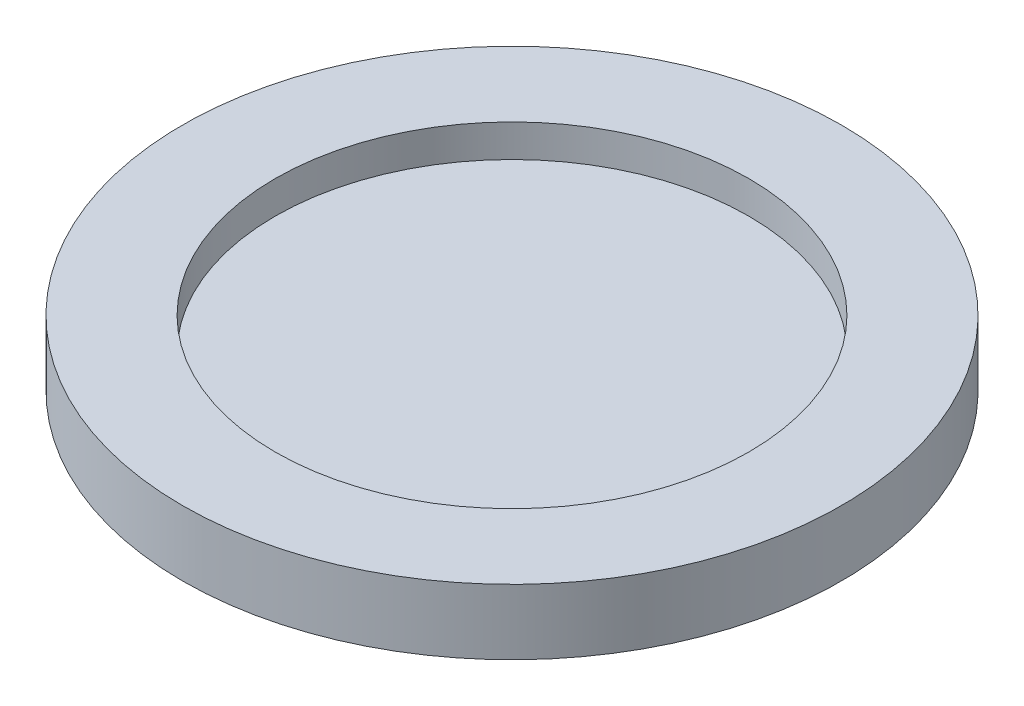
ISO-10303-21;
HEADER;
FILE_DESCRIPTION(('STEP AP214'),'2;1');
FILE_NAME('part.step','',(''),(''),'','','');
FILE_SCHEMA(('AUTOMOTIVE_DESIGN { 1 0 10303 214 1 1 1 1 }'));
ENDSEC;
DATA;
#1=APPLICATION_CONTEXT('core data for automotive mechanical design processes');
#2=APPLICATION_PROTOCOL_DEFINITION('international standard','automotive_design',2000,#1);
#3=PRODUCT_CONTEXT('',#1,'mechanical');
#4=PRODUCT('Part','Part','',(#3));
#5=PRODUCT_RELATED_PRODUCT_CATEGORY('part','',(#4));
#6=PRODUCT_DEFINITION_FORMATION('','',#4);
#7=PRODUCT_DEFINITION_CONTEXT('part definition',#1,'design');
#8=PRODUCT_DEFINITION('design','',#6,#7);
#9=PRODUCT_DEFINITION_SHAPE('','',#8);
#10=(LENGTH_UNIT() NAMED_UNIT(*) SI_UNIT(.MILLI.,.METRE.));
#11=(NAMED_UNIT(*) PLANE_ANGLE_UNIT() SI_UNIT($,.RADIAN.));
#12=(NAMED_UNIT(*) SI_UNIT($,.STERADIAN.) SOLID_ANGLE_UNIT());
#13=UNCERTAINTY_MEASURE_WITH_UNIT(LENGTH_MEASURE(1.E-05),#10,'distance_accuracy_value','');
#14=(GEOMETRIC_REPRESENTATION_CONTEXT(3) GLOBAL_UNCERTAINTY_ASSIGNED_CONTEXT((#13)) GLOBAL_UNIT_ASSIGNED_CONTEXT((#10,
#11,#12)) REPRESENTATION_CONTEXT('',''));
#15=CARTESIAN_POINT('',(0.,0.,0.));
#16=DIRECTION('',(0.,0.,1.));
#17=DIRECTION('',(1.,0.,0.));
#18=AXIS2_PLACEMENT_3D('',#15,#16,#17);
#19=CARTESIAN_POINT('',(0.,2.6924,0.));
#20=DIRECTION('',(0.,1.,0.));
#21=DIRECTION('',(0.,0.,1.));
#22=AXIS2_PLACEMENT_3D('',#19,#20,#21);
#23=PLANE('',#22);
#24=CARTESIAN_POINT('',(0.,2.6924,0.));
#25=DIRECTION('',(0.,1.,0.));
#26=DIRECTION('',(0.,0.,1.));
#27=AXIS2_PLACEMENT_3D('',#24,#25,#26);
#28=CIRCLE('',#27,13.589);
#29=CARTESIAN_POINT('',(0.,2.6924,13.589));
#30=VERTEX_POINT('',#29);
#31=EDGE_CURVE('E37',#30,#30,#28,.T.);
#32=ORIENTED_EDGE('',*,*,#31,.T.);
#33=EDGE_LOOP('',(#32));
#34=FACE_BOUND('',#33,.T.);
#35=CARTESIAN_POINT('',(0.,2.6924,0.));
#36=DIRECTION('',(0.,1.,0.));
#37=DIRECTION('',(0.,0.,1.));
#38=AXIS2_PLACEMENT_3D('',#35,#36,#37);
#39=CIRCLE('',#38,9.7663);
#40=CARTESIAN_POINT('',(0.,2.6924,9.7663));
#41=VERTEX_POINT('',#40);
#42=EDGE_CURVE('E46',#41,#41,#39,.T.);
#43=ORIENTED_EDGE('',*,*,#42,.F.);
#44=EDGE_LOOP('',(#43));
#45=FACE_BOUND('',#44,.T.);
#46=ADVANCED_FACE('F30',(#34,#45),#23,.T.);
#47=CARTESIAN_POINT('',(0.,0.,0.));
#48=DIRECTION('',(0.,1.,0.));
#49=DIRECTION('',(0.,0.,1.));
#50=AXIS2_PLACEMENT_3D('',#47,#48,#49);
#51=PLANE('',#50);
#52=CARTESIAN_POINT('',(0.,0.,0.));
#53=DIRECTION('',(0.,-1.,0.));
#54=DIRECTION('',(0.,0.,-1.));
#55=AXIS2_PLACEMENT_3D('',#52,#53,#54);
#56=CIRCLE('',#55,9.7663);
#57=CARTESIAN_POINT('',(0.,0.,-9.7663));
#58=VERTEX_POINT('',#57);
#59=EDGE_CURVE('E51',#58,#58,#56,.T.);
#60=ORIENTED_EDGE('',*,*,#59,.F.);
#61=EDGE_LOOP('',(#60));
#62=FACE_BOUND('',#61,.T.);
#63=CARTESIAN_POINT('',(0.,0.,0.));
#64=DIRECTION('',(0.,1.,0.));
#65=DIRECTION('',(0.,0.,1.));
#66=AXIS2_PLACEMENT_3D('',#63,#64,#65);
#67=CIRCLE('',#66,13.589);
#68=CARTESIAN_POINT('',(0.,0.,13.589));
#69=VERTEX_POINT('',#68);
#70=EDGE_CURVE('E41',#69,#69,#67,.T.);
#71=ORIENTED_EDGE('',*,*,#70,.F.);
#72=EDGE_LOOP('',(#71));
#73=FACE_BOUND('',#72,.T.);
#74=ADVANCED_FACE('F66',(#62,#73),#51,.F.);
#75=CARTESIAN_POINT('',(0.,2.6924,0.));
#76=DIRECTION('',(0.,-1.,0.));
#77=DIRECTION('',(0.,0.,-1.));
#78=AXIS2_PLACEMENT_3D('',#75,#76,#77);
#79=CYLINDRICAL_SURFACE('',#78,13.589);
#80=ORIENTED_EDGE('',*,*,#31,.F.);
#81=EDGE_LOOP('',(#80));
#82=FACE_BOUND('',#81,.T.);
#83=ORIENTED_EDGE('',*,*,#70,.T.);
#84=EDGE_LOOP('',(#83));
#85=FACE_BOUND('',#84,.T.);
#86=ADVANCED_FACE('F32',(#82,#85),#79,.T.);
#87=CARTESIAN_POINT('',(0.,2.6924,0.));
#88=DIRECTION('',(0.,-1.,0.));
#89=DIRECTION('',(0.,0.,-1.));
#90=AXIS2_PLACEMENT_3D('',#87,#88,#89);
#91=CYLINDRICAL_SURFACE('',#90,9.7663);
#92=CARTESIAN_POINT('',(0.,1.35,0.));
#93=DIRECTION('',(0.,1.,0.));
#94=DIRECTION('',(0.,0.,1.));
#95=AXIS2_PLACEMENT_3D('',#92,#93,#94);
#96=CIRCLE('',#95,9.7663);
#97=CARTESIAN_POINT('',(0.,1.35,9.7663));
#98=VERTEX_POINT('',#97);
#99=EDGE_CURVE('E10',#98,#98,#96,.T.);
#100=ORIENTED_EDGE('',*,*,#99,.F.);
#101=EDGE_LOOP('',(#100));
#102=FACE_BOUND('',#101,.T.);
#103=ORIENTED_EDGE('',*,*,#42,.T.);
#104=EDGE_LOOP('',(#103));
#105=FACE_BOUND('',#104,.T.);
#106=ADVANCED_FACE('F72',(#102,#105),#91,.F.);
#107=CARTESIAN_POINT('',(0.,1.35,0.));
#108=DIRECTION('',(0.,1.,0.));
#109=DIRECTION('',(0.,0.,1.));
#110=AXIS2_PLACEMENT_3D('',#107,#108,#109);
#111=PLANE('',#110);
#112=ORIENTED_EDGE('',*,*,#99,.T.);
#113=EDGE_LOOP('',(#112));
#114=FACE_BOUND('',#113,.T.);
#115=ADVANCED_FACE('F62',(#114),#111,.T.);
#116=CARTESIAN_POINT('',(0.,1.25,0.));
#117=DIRECTION('',(0.,-1.,0.));
#118=DIRECTION('',(0.,0.,-1.));
#119=AXIS2_PLACEMENT_3D('',#116,#117,#118);
#120=CYLINDRICAL_SURFACE('',#119,9.7663);
#121=CARTESIAN_POINT('',(0.,1.25,0.));
#122=DIRECTION('',(0.,-1.,0.));
#123=DIRECTION('',(0.,0.,-1.));
#124=AXIS2_PLACEMENT_3D('',#121,#122,#123);
#125=CIRCLE('',#124,9.7663);
#126=CARTESIAN_POINT('',(0.,1.25,-9.7663));
#127=VERTEX_POINT('',#126);
#128=EDGE_CURVE('E50',#127,#127,#125,.T.);
#129=ORIENTED_EDGE('',*,*,#128,.F.);
#130=EDGE_LOOP('',(#129));
#131=FACE_BOUND('',#130,.T.);
#132=ORIENTED_EDGE('',*,*,#59,.T.);
#133=EDGE_LOOP('',(#132));
#134=FACE_BOUND('',#133,.T.);
#135=ADVANCED_FACE('F59',(#131,#134),#120,.F.);
#136=CARTESIAN_POINT('',(0.,1.25,0.));
#137=DIRECTION('',(0.,-1.,0.));
#138=DIRECTION('',(0.,0.,-1.));
#139=AXIS2_PLACEMENT_3D('',#136,#137,#138);
#140=PLANE('',#139);
#141=ORIENTED_EDGE('',*,*,#128,.T.);
#142=EDGE_LOOP('',(#141));
#143=FACE_BOUND('',#142,.T.);
#144=ADVANCED_FACE('F57',(#143),#140,.T.);
#145=CLOSED_SHELL('',(#46,#74,#86,#106,#115,#135,#144));
#146=MANIFOLD_SOLID_BREP('B2',#145);
#147=ADVANCED_BREP_SHAPE_REPRESENTATION('',(#18,#146),#14);
#148=SHAPE_DEFINITION_REPRESENTATION(#9,#147);
ENDSEC;
END-ISO-10303-21;
